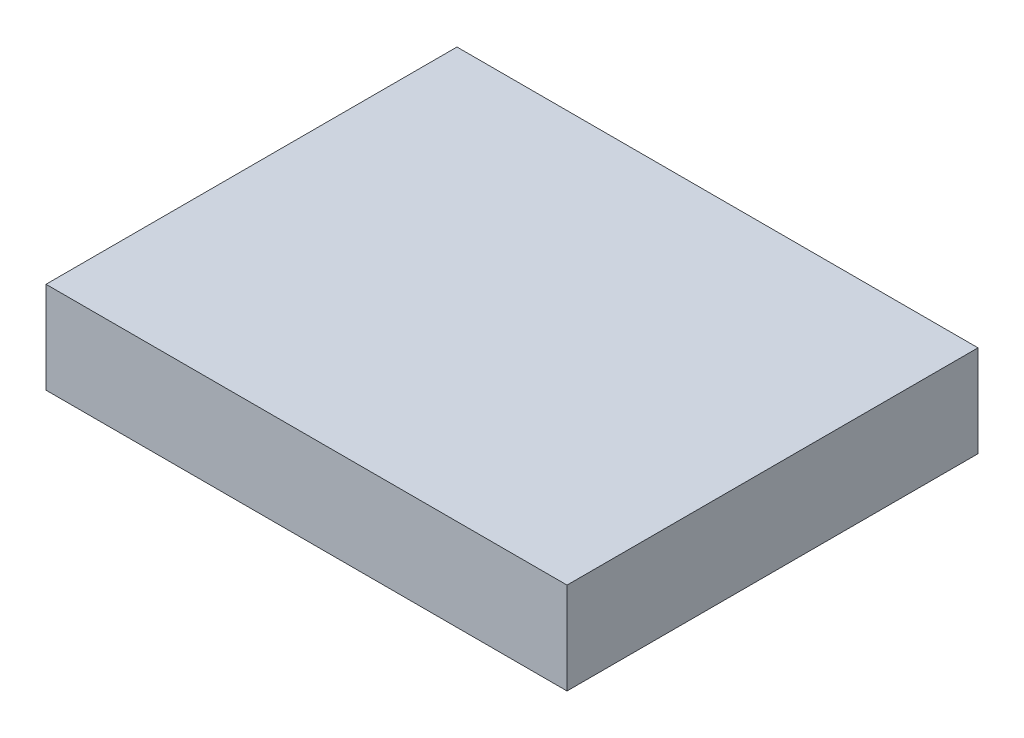
ISO-10303-21;
HEADER;
FILE_DESCRIPTION(('STEP AP214'),'2;1');
FILE_NAME('part.step','',(''),(''),'','','');
FILE_SCHEMA(('AUTOMOTIVE_DESIGN { 1 0 10303 214 1 1 1 1 }'));
ENDSEC;
DATA;
#1=APPLICATION_CONTEXT('core data for automotive mechanical design processes');
#2=APPLICATION_PROTOCOL_DEFINITION('international standard','automotive_design',2000,#1);
#3=PRODUCT_CONTEXT('',#1,'mechanical');
#4=PRODUCT('Part','Part','',(#3));
#5=PRODUCT_RELATED_PRODUCT_CATEGORY('part','',(#4));
#6=PRODUCT_DEFINITION_FORMATION('','',#4);
#7=PRODUCT_DEFINITION_CONTEXT('part definition',#1,'design');
#8=PRODUCT_DEFINITION('design','',#6,#7);
#9=PRODUCT_DEFINITION_SHAPE('','',#8);
#10=(LENGTH_UNIT() NAMED_UNIT(*) SI_UNIT(.MILLI.,.METRE.));
#11=(NAMED_UNIT(*) PLANE_ANGLE_UNIT() SI_UNIT($,.RADIAN.));
#12=(NAMED_UNIT(*) SI_UNIT($,.STERADIAN.) SOLID_ANGLE_UNIT());
#13=UNCERTAINTY_MEASURE_WITH_UNIT(LENGTH_MEASURE(1.E-05),#10,'distance_accuracy_value','');
#14=(GEOMETRIC_REPRESENTATION_CONTEXT(3) GLOBAL_UNCERTAINTY_ASSIGNED_CONTEXT((#13)) GLOBAL_UNIT_ASSIGNED_CONTEXT((#10,
#11,#12)) REPRESENTATION_CONTEXT('',''));
#15=CARTESIAN_POINT('',(0.,0.,0.));
#16=DIRECTION('',(0.,0.,1.));
#17=DIRECTION('',(1.,0.,0.));
#18=AXIS2_PLACEMENT_3D('',#15,#16,#17);
#19=CARTESIAN_POINT('',(0.,12.5,0.));
#20=DIRECTION('',(1.,0.,0.));
#21=DIRECTION('',(0.,0.,-1.));
#22=AXIS2_PLACEMENT_3D('',#19,#20,#21);
#23=PLANE('',#22);
#24=DIRECTION('',(0.,0.,1.));
#25=VECTOR('',#24,1.);
#26=CARTESIAN_POINT('',(0.,0.,0.));
#27=LINE('',#26,#25);
#28=CARTESIAN_POINT('',(0.,0.,-56.));
#29=VERTEX_POINT('',#28);
#30=CARTESIAN_POINT('',(0.,0.,0.));
#31=VERTEX_POINT('',#30);
#32=EDGE_CURVE('E96',#29,#31,#27,.T.);
#33=ORIENTED_EDGE('',*,*,#32,.T.);
#34=DIRECTION('',(0.,-1.,0.));
#35=VECTOR('',#34,1.);
#36=CARTESIAN_POINT('',(0.,12.5,0.));
#37=LINE('',#36,#35);
#38=CARTESIAN_POINT('',(0.,12.5,0.));
#39=VERTEX_POINT('',#38);
#40=EDGE_CURVE('E11',#39,#31,#37,.T.);
#41=ORIENTED_EDGE('',*,*,#40,.F.);
#42=DIRECTION('',(0.,0.,1.));
#43=VECTOR('',#42,1.);
#44=CARTESIAN_POINT('',(0.,12.5,0.));
#45=LINE('',#44,#43);
#46=CARTESIAN_POINT('',(0.,12.5,-56.));
#47=VERTEX_POINT('',#46);
#48=EDGE_CURVE('E84',#47,#39,#45,.T.);
#49=ORIENTED_EDGE('',*,*,#48,.F.);
#50=DIRECTION('',(0.,-1.,0.));
#51=VECTOR('',#50,1.);
#52=CARTESIAN_POINT('',(0.,12.5,-56.));
#53=LINE('',#52,#51);
#54=EDGE_CURVE('E92',#47,#29,#53,.T.);
#55=ORIENTED_EDGE('',*,*,#54,.T.);
#56=EDGE_LOOP('',(#33,#41,#49,#55));
#57=FACE_BOUND('',#56,.T.);
#58=ADVANCED_FACE('F33',(#57),#23,.F.);
#59=CARTESIAN_POINT('',(0.,12.5,0.));
#60=DIRECTION('',(0.,0.,-1.));
#61=DIRECTION('',(-1.,0.,0.));
#62=AXIS2_PLACEMENT_3D('',#59,#60,#61);
#63=PLANE('',#62);
#64=DIRECTION('',(1.,0.,0.));
#65=VECTOR('',#64,1.);
#66=CARTESIAN_POINT('',(0.,0.,0.));
#67=LINE('',#66,#65);
#68=CARTESIAN_POINT('',(71.,0.,0.));
#69=VERTEX_POINT('',#68);
#70=EDGE_CURVE('E88',#31,#69,#67,.T.);
#71=ORIENTED_EDGE('',*,*,#70,.T.);
#72=DIRECTION('',(0.,-1.,0.));
#73=VECTOR('',#72,1.);
#74=CARTESIAN_POINT('',(71.,12.5,0.));
#75=LINE('',#74,#73);
#76=CARTESIAN_POINT('',(71.,12.5,0.));
#77=VERTEX_POINT('',#76);
#78=EDGE_CURVE('E41',#77,#69,#75,.T.);
#79=ORIENTED_EDGE('',*,*,#78,.F.);
#80=DIRECTION('',(1.,0.,0.));
#81=VECTOR('',#80,1.);
#82=CARTESIAN_POINT('',(0.,12.5,0.));
#83=LINE('',#82,#81);
#84=EDGE_CURVE('E79',#39,#77,#83,.T.);
#85=ORIENTED_EDGE('',*,*,#84,.F.);
#86=ORIENTED_EDGE('',*,*,#40,.T.);
#87=EDGE_LOOP('',(#71,#79,#85,#86));
#88=FACE_BOUND('',#87,.T.);
#89=ADVANCED_FACE('F87',(#88),#63,.F.);
#90=CARTESIAN_POINT('',(71.,12.5,0.));
#91=DIRECTION('',(-1.,0.,0.));
#92=DIRECTION('',(0.,0.,1.));
#93=AXIS2_PLACEMENT_3D('',#90,#91,#92);
#94=PLANE('',#93);
#95=DIRECTION('',(0.,0.,-1.));
#96=VECTOR('',#95,1.);
#97=CARTESIAN_POINT('',(71.,0.,0.));
#98=LINE('',#97,#96);
#99=CARTESIAN_POINT('',(71.,0.,-56.));
#100=VERTEX_POINT('',#99);
#101=EDGE_CURVE('E66',#69,#100,#98,.T.);
#102=ORIENTED_EDGE('',*,*,#101,.T.);
#103=DIRECTION('',(0.,-1.,0.));
#104=VECTOR('',#103,1.);
#105=CARTESIAN_POINT('',(71.,12.5,-56.));
#106=LINE('',#105,#104);
#107=CARTESIAN_POINT('',(71.,12.5,-56.));
#108=VERTEX_POINT('',#107);
#109=EDGE_CURVE('E89',#108,#100,#106,.T.);
#110=ORIENTED_EDGE('',*,*,#109,.F.);
#111=DIRECTION('',(0.,0.,-1.));
#112=VECTOR('',#111,1.);
#113=CARTESIAN_POINT('',(71.,12.5,0.));
#114=LINE('',#113,#112);
#115=EDGE_CURVE('E82',#77,#108,#114,.T.);
#116=ORIENTED_EDGE('',*,*,#115,.F.);
#117=ORIENTED_EDGE('',*,*,#78,.T.);
#118=EDGE_LOOP('',(#102,#110,#116,#117));
#119=FACE_BOUND('',#118,.T.);
#120=ADVANCED_FACE('F90',(#119),#94,.F.);
#121=CARTESIAN_POINT('',(0.,12.5,-56.));
#122=DIRECTION('',(0.,0.,1.));
#123=DIRECTION('',(1.,0.,0.));
#124=AXIS2_PLACEMENT_3D('',#121,#122,#123);
#125=PLANE('',#124);
#126=DIRECTION('',(-1.,0.,0.));
#127=VECTOR('',#126,1.);
#128=CARTESIAN_POINT('',(0.,0.,-56.));
#129=LINE('',#128,#127);
#130=EDGE_CURVE('E72',#100,#29,#129,.T.);
#131=ORIENTED_EDGE('',*,*,#130,.T.);
#132=ORIENTED_EDGE('',*,*,#54,.F.);
#133=DIRECTION('',(-1.,0.,0.));
#134=VECTOR('',#133,1.);
#135=CARTESIAN_POINT('',(0.,12.5,-56.));
#136=LINE('',#135,#134);
#137=EDGE_CURVE('E49',#108,#47,#136,.T.);
#138=ORIENTED_EDGE('',*,*,#137,.F.);
#139=ORIENTED_EDGE('',*,*,#109,.T.);
#140=EDGE_LOOP('',(#131,#132,#138,#139));
#141=FACE_BOUND('',#140,.T.);
#142=ADVANCED_FACE('F103',(#141),#125,.F.);
#143=CARTESIAN_POINT('',(0.,12.5,0.));
#144=DIRECTION('',(0.,-1.,0.));
#145=DIRECTION('',(0.,0.,-1.));
#146=AXIS2_PLACEMENT_3D('',#143,#144,#145);
#147=PLANE('',#146);
#148=ORIENTED_EDGE('',*,*,#48,.T.);
#149=ORIENTED_EDGE('',*,*,#84,.T.);
#150=ORIENTED_EDGE('',*,*,#115,.T.);
#151=ORIENTED_EDGE('',*,*,#137,.T.);
#152=EDGE_LOOP('',(#148,#149,#150,#151));
#153=FACE_BOUND('',#152,.T.);
#154=ADVANCED_FACE('F80',(#153),#147,.F.);
#155=CARTESIAN_POINT('',(0.,0.,0.));
#156=DIRECTION('',(0.,-1.,0.));
#157=DIRECTION('',(0.,0.,-1.));
#158=AXIS2_PLACEMENT_3D('',#155,#156,#157);
#159=PLANE('',#158);
#160=ORIENTED_EDGE('',*,*,#32,.F.);
#161=ORIENTED_EDGE('',*,*,#130,.F.);
#162=ORIENTED_EDGE('',*,*,#101,.F.);
#163=ORIENTED_EDGE('',*,*,#70,.F.);
#164=EDGE_LOOP('',(#160,#161,#162,#163));
#165=FACE_BOUND('',#164,.T.);
#166=ADVANCED_FACE('F106',(#165),#159,.T.);
#167=CLOSED_SHELL('',(#58,#89,#120,#142,#154,#166));
#168=MANIFOLD_SOLID_BREP('B2',#167);
#169=ADVANCED_BREP_SHAPE_REPRESENTATION('',(#18,#168),#14);
#170=SHAPE_DEFINITION_REPRESENTATION(#9,#169);
ENDSEC;
END-ISO-10303-21;
